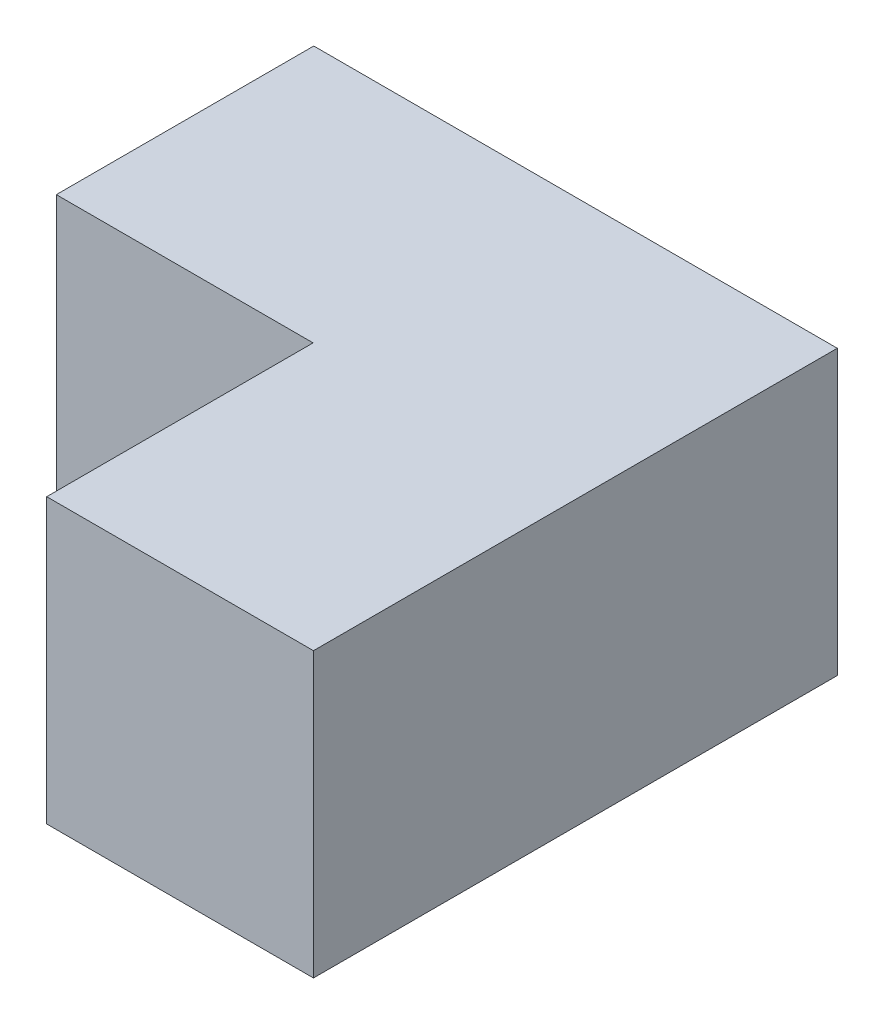
ISO-10303-21;
HEADER;
FILE_DESCRIPTION(('STEP AP214'),'2;1');
FILE_NAME('part.step','',(''),(''),'','','');
FILE_SCHEMA(('AUTOMOTIVE_DESIGN { 1 0 10303 214 1 1 1 1 }'));
ENDSEC;
DATA;
#1=APPLICATION_CONTEXT('core data for automotive mechanical design processes');
#2=APPLICATION_PROTOCOL_DEFINITION('international standard','automotive_design',2000,#1);
#3=PRODUCT_CONTEXT('',#1,'mechanical');
#4=PRODUCT('Part','Part','',(#3));
#5=PRODUCT_RELATED_PRODUCT_CATEGORY('part','',(#4));
#6=PRODUCT_DEFINITION_FORMATION('','',#4);
#7=PRODUCT_DEFINITION_CONTEXT('part definition',#1,'design');
#8=PRODUCT_DEFINITION('design','',#6,#7);
#9=PRODUCT_DEFINITION_SHAPE('','',#8);
#10=(LENGTH_UNIT() NAMED_UNIT(*) SI_UNIT(.MILLI.,.METRE.));
#11=(NAMED_UNIT(*) PLANE_ANGLE_UNIT() SI_UNIT($,.RADIAN.));
#12=(NAMED_UNIT(*) SI_UNIT($,.STERADIAN.) SOLID_ANGLE_UNIT());
#13=UNCERTAINTY_MEASURE_WITH_UNIT(LENGTH_MEASURE(1.E-05),#10,'distance_accuracy_value','');
#14=(GEOMETRIC_REPRESENTATION_CONTEXT(3) GLOBAL_UNCERTAINTY_ASSIGNED_CONTEXT((#13)) GLOBAL_UNIT_ASSIGNED_CONTEXT((#10,
#11,#12)) REPRESENTATION_CONTEXT('',''));
#15=CARTESIAN_POINT('',(0.,0.,0.));
#16=DIRECTION('',(0.,0.,1.));
#17=DIRECTION('',(1.,0.,0.));
#18=AXIS2_PLACEMENT_3D('',#15,#16,#17);
#19=CARTESIAN_POINT('',(127.017693124665,25.4,-195.999460881352));
#20=DIRECTION('',(1.,0.,0.));
#21=DIRECTION('',(0.,0.,-1.));
#22=AXIS2_PLACEMENT_3D('',#19,#20,#21);
#23=PLANE('',#22);
#24=DIRECTION('',(0.,0.,1.));
#25=VECTOR('',#24,1.);
#26=CARTESIAN_POINT('',(127.017693124665,0.,-195.999460881352));
#27=LINE('',#26,#25);
#28=CARTESIAN_POINT('',(127.017693124665,0.,-219.067642019415));
#29=VERTEX_POINT('',#28);
#30=CARTESIAN_POINT('',(127.017693124665,0.,-195.999460881352));
#31=VERTEX_POINT('',#30);
#32=EDGE_CURVE('E128',#29,#31,#27,.T.);
#33=ORIENTED_EDGE('',*,*,#32,.T.);
#34=DIRECTION('',(0.,-1.,0.));
#35=VECTOR('',#34,1.);
#36=CARTESIAN_POINT('',(127.017693124665,25.4,-195.999460881352));
#37=LINE('',#36,#35);
#38=CARTESIAN_POINT('',(127.017693124665,25.4,-195.999460881352));
#39=VERTEX_POINT('',#38);
#40=EDGE_CURVE('E12',#39,#31,#37,.T.);
#41=ORIENTED_EDGE('',*,*,#40,.F.);
#42=DIRECTION('',(0.,0.,1.));
#43=VECTOR('',#42,1.);
#44=CARTESIAN_POINT('',(127.017693124665,25.4,-195.999460881352));
#45=LINE('',#44,#43);
#46=CARTESIAN_POINT('',(127.017693124665,25.4,-219.067642019415));
#47=VERTEX_POINT('',#46);
#48=EDGE_CURVE('E144',#47,#39,#45,.T.);
#49=ORIENTED_EDGE('',*,*,#48,.F.);
#50=DIRECTION('',(0.,-1.,0.));
#51=VECTOR('',#50,1.);
#52=CARTESIAN_POINT('',(127.017693124665,25.4,-219.067642019415));
#53=LINE('',#52,#51);
#54=EDGE_CURVE('E124',#47,#29,#53,.T.);
#55=ORIENTED_EDGE('',*,*,#54,.T.);
#56=EDGE_LOOP('',(#33,#41,#49,#55));
#57=FACE_BOUND('',#56,.T.);
#58=ADVANCED_FACE('F39',(#57),#23,.F.);
#59=CARTESIAN_POINT('',(127.017693124665,25.4,-195.999460881352));
#60=DIRECTION('',(0.,0.,-1.));
#61=DIRECTION('',(-1.,0.,0.));
#62=AXIS2_PLACEMENT_3D('',#59,#60,#61);
#63=PLANE('',#62);
#64=DIRECTION('',(1.,0.,0.));
#65=VECTOR('',#64,1.);
#66=CARTESIAN_POINT('',(127.017693124665,0.,-195.999460881352));
#67=LINE('',#66,#65);
#68=CARTESIAN_POINT('',(150.026111112882,0.,-195.999460881352));
#69=VERTEX_POINT('',#68);
#70=EDGE_CURVE('E132',#31,#69,#67,.T.);
#71=ORIENTED_EDGE('',*,*,#70,.T.);
#72=DIRECTION('',(0.,-1.,0.));
#73=VECTOR('',#72,1.);
#74=CARTESIAN_POINT('',(150.026111112882,25.4,-195.999460881352));
#75=LINE('',#74,#73);
#76=CARTESIAN_POINT('',(150.026111112882,25.4,-195.999460881352));
#77=VERTEX_POINT('',#76);
#78=EDGE_CURVE('E48',#77,#69,#75,.T.);
#79=ORIENTED_EDGE('',*,*,#78,.F.);
#80=DIRECTION('',(1.,0.,0.));
#81=VECTOR('',#80,1.);
#82=CARTESIAN_POINT('',(127.017693124665,25.4,-195.999460881352));
#83=LINE('',#82,#81);
#84=EDGE_CURVE('E93',#39,#77,#83,.T.);
#85=ORIENTED_EDGE('',*,*,#84,.F.);
#86=ORIENTED_EDGE('',*,*,#40,.T.);
#87=EDGE_LOOP('',(#71,#79,#85,#86));
#88=FACE_BOUND('',#87,.T.);
#89=ADVANCED_FACE('F172',(#88),#63,.F.);
#90=CARTESIAN_POINT('',(150.026111112882,25.4,-172.13008551475));
#91=DIRECTION('',(1.,0.,0.));
#92=DIRECTION('',(0.,0.,-1.));
#93=AXIS2_PLACEMENT_3D('',#90,#91,#92);
#94=PLANE('',#93);
#95=DIRECTION('',(0.,0.,1.));
#96=VECTOR('',#95,1.);
#97=CARTESIAN_POINT('',(150.026111112882,0.,-172.13008551475));
#98=LINE('',#97,#96);
#99=CARTESIAN_POINT('',(150.026111112882,0.,-172.13008551475));
#100=VERTEX_POINT('',#99);
#101=EDGE_CURVE('E135',#69,#100,#98,.T.);
#102=ORIENTED_EDGE('',*,*,#101,.T.);
#103=DIRECTION('',(0.,-1.,0.));
#104=VECTOR('',#103,1.);
#105=CARTESIAN_POINT('',(150.026111112882,25.4,-172.13008551475));
#106=LINE('',#105,#104);
#107=CARTESIAN_POINT('',(150.026111112882,25.4,-172.13008551475));
#108=VERTEX_POINT('',#107);
#109=EDGE_CURVE('E117',#108,#100,#106,.T.);
#110=ORIENTED_EDGE('',*,*,#109,.F.);
#111=DIRECTION('',(0.,0.,1.));
#112=VECTOR('',#111,1.);
#113=CARTESIAN_POINT('',(150.026111112882,25.4,-172.13008551475));
#114=LINE('',#113,#112);
#115=EDGE_CURVE('E106',#77,#108,#114,.T.);
#116=ORIENTED_EDGE('',*,*,#115,.F.);
#117=ORIENTED_EDGE('',*,*,#78,.T.);
#118=EDGE_LOOP('',(#102,#110,#116,#117));
#119=FACE_BOUND('',#118,.T.);
#120=ADVANCED_FACE('F154',(#119),#94,.F.);
#121=CARTESIAN_POINT('',(173.927929859074,25.4,-172.13008551475));
#122=DIRECTION('',(0.,0.,-1.));
#123=DIRECTION('',(-1.,0.,0.));
#124=AXIS2_PLACEMENT_3D('',#121,#122,#123);
#125=PLANE('',#124);
#126=DIRECTION('',(1.,0.,0.));
#127=VECTOR('',#126,1.);
#128=CARTESIAN_POINT('',(173.927929859074,0.,-172.13008551475));
#129=LINE('',#128,#127);
#130=CARTESIAN_POINT('',(173.927929859074,0.,-172.13008551475));
#131=VERTEX_POINT('',#130);
#132=EDGE_CURVE('E115',#100,#131,#129,.T.);
#133=ORIENTED_EDGE('',*,*,#132,.T.);
#134=DIRECTION('',(0.,-1.,0.));
#135=VECTOR('',#134,1.);
#136=CARTESIAN_POINT('',(173.927929859074,25.4,-172.13008551475));
#137=LINE('',#136,#135);
#138=CARTESIAN_POINT('',(173.927929859074,25.4,-172.13008551475));
#139=VERTEX_POINT('',#138);
#140=EDGE_CURVE('E112',#139,#131,#137,.T.);
#141=ORIENTED_EDGE('',*,*,#140,.F.);
#142=DIRECTION('',(1.,0.,0.));
#143=VECTOR('',#142,1.);
#144=CARTESIAN_POINT('',(173.927929859074,25.4,-172.13008551475));
#145=LINE('',#144,#143);
#146=EDGE_CURVE('E100',#108,#139,#145,.T.);
#147=ORIENTED_EDGE('',*,*,#146,.F.);
#148=ORIENTED_EDGE('',*,*,#109,.T.);
#149=EDGE_LOOP('',(#133,#141,#147,#148));
#150=FACE_BOUND('',#149,.T.);
#151=ADVANCED_FACE('F113',(#150),#125,.F.);
#152=CARTESIAN_POINT('',(173.927929859074,25.4,-172.13008551475));
#153=DIRECTION('',(-1.,0.,0.));
#154=DIRECTION('',(0.,0.,1.));
#155=AXIS2_PLACEMENT_3D('',#152,#153,#154);
#156=PLANE('',#155);
#157=DIRECTION('',(0.,0.,-1.));
#158=VECTOR('',#157,1.);
#159=CARTESIAN_POINT('',(173.927929859074,0.,-172.13008551475));
#160=LINE('',#159,#158);
#161=CARTESIAN_POINT('',(173.927929859074,0.,-219.067642019415));
#162=VERTEX_POINT('',#161);
#163=EDGE_CURVE('E79',#131,#162,#160,.T.);
#164=ORIENTED_EDGE('',*,*,#163,.T.);
#165=DIRECTION('',(0.,-1.,0.));
#166=VECTOR('',#165,1.);
#167=CARTESIAN_POINT('',(173.927929859074,25.4,-219.067642019415));
#168=LINE('',#167,#166);
#169=CARTESIAN_POINT('',(173.927929859074,25.4,-219.067642019415));
#170=VERTEX_POINT('',#169);
#171=EDGE_CURVE('E118',#170,#162,#168,.T.);
#172=ORIENTED_EDGE('',*,*,#171,.F.);
#173=DIRECTION('',(0.,0.,-1.));
#174=VECTOR('',#173,1.);
#175=CARTESIAN_POINT('',(173.927929859074,25.4,-172.13008551475));
#176=LINE('',#175,#174);
#177=EDGE_CURVE('E104',#139,#170,#176,.T.);
#178=ORIENTED_EDGE('',*,*,#177,.F.);
#179=ORIENTED_EDGE('',*,*,#140,.T.);
#180=EDGE_LOOP('',(#164,#172,#178,#179));
#181=FACE_BOUND('',#180,.T.);
#182=ADVANCED_FACE('F120',(#181),#156,.F.);
#183=CARTESIAN_POINT('',(173.927929859074,25.4,-219.067642019415));
#184=DIRECTION('',(0.,0.,1.));
#185=DIRECTION('',(1.,0.,0.));
#186=AXIS2_PLACEMENT_3D('',#183,#184,#185);
#187=PLANE('',#186);
#188=DIRECTION('',(-1.,0.,0.));
#189=VECTOR('',#188,1.);
#190=CARTESIAN_POINT('',(173.927929859074,0.,-219.067642019415));
#191=LINE('',#190,#189);
#192=EDGE_CURVE('E85',#162,#29,#191,.T.);
#193=ORIENTED_EDGE('',*,*,#192,.T.);
#194=ORIENTED_EDGE('',*,*,#54,.F.);
#195=DIRECTION('',(-1.,0.,0.));
#196=VECTOR('',#195,1.);
#197=CARTESIAN_POINT('',(173.927929859074,25.4,-219.067642019415));
#198=LINE('',#197,#196);
#199=EDGE_CURVE('E56',#170,#47,#198,.T.);
#200=ORIENTED_EDGE('',*,*,#199,.F.);
#201=ORIENTED_EDGE('',*,*,#171,.T.);
#202=EDGE_LOOP('',(#193,#194,#200,#201));
#203=FACE_BOUND('',#202,.T.);
#204=ADVANCED_FACE('F161',(#203),#187,.F.);
#205=CARTESIAN_POINT('',(0.,25.4,0.));
#206=DIRECTION('',(0.,1.,0.));
#207=DIRECTION('',(0.,0.,1.));
#208=AXIS2_PLACEMENT_3D('',#205,#206,#207);
#209=PLANE('',#208);
#210=ORIENTED_EDGE('',*,*,#48,.T.);
#211=ORIENTED_EDGE('',*,*,#84,.T.);
#212=ORIENTED_EDGE('',*,*,#115,.T.);
#213=ORIENTED_EDGE('',*,*,#146,.T.);
#214=ORIENTED_EDGE('',*,*,#177,.T.);
#215=ORIENTED_EDGE('',*,*,#199,.T.);
#216=EDGE_LOOP('',(#210,#211,#212,#213,#214,#215));
#217=FACE_BOUND('',#216,.T.);
#218=ADVANCED_FACE('F102',(#217),#209,.T.);
#219=CARTESIAN_POINT('',(0.,0.,0.));
#220=DIRECTION('',(0.,1.,0.));
#221=DIRECTION('',(0.,0.,1.));
#222=AXIS2_PLACEMENT_3D('',#219,#220,#221);
#223=PLANE('',#222);
#224=ORIENTED_EDGE('',*,*,#32,.F.);
#225=ORIENTED_EDGE('',*,*,#192,.F.);
#226=ORIENTED_EDGE('',*,*,#163,.F.);
#227=ORIENTED_EDGE('',*,*,#132,.F.);
#228=ORIENTED_EDGE('',*,*,#101,.F.);
#229=ORIENTED_EDGE('',*,*,#70,.F.);
#230=EDGE_LOOP('',(#224,#225,#226,#227,#228,#229));
#231=FACE_BOUND('',#230,.T.);
#232=ADVANCED_FACE('F157',(#231),#223,.F.);
#233=CLOSED_SHELL('',(#58,#89,#120,#151,#182,#204,#218,#232));
#234=MANIFOLD_SOLID_BREP('B2',#233);
#235=ADVANCED_BREP_SHAPE_REPRESENTATION('',(#18,#234),#14);
#236=SHAPE_DEFINITION_REPRESENTATION(#9,#235);
ENDSEC;
END-ISO-10303-21;
